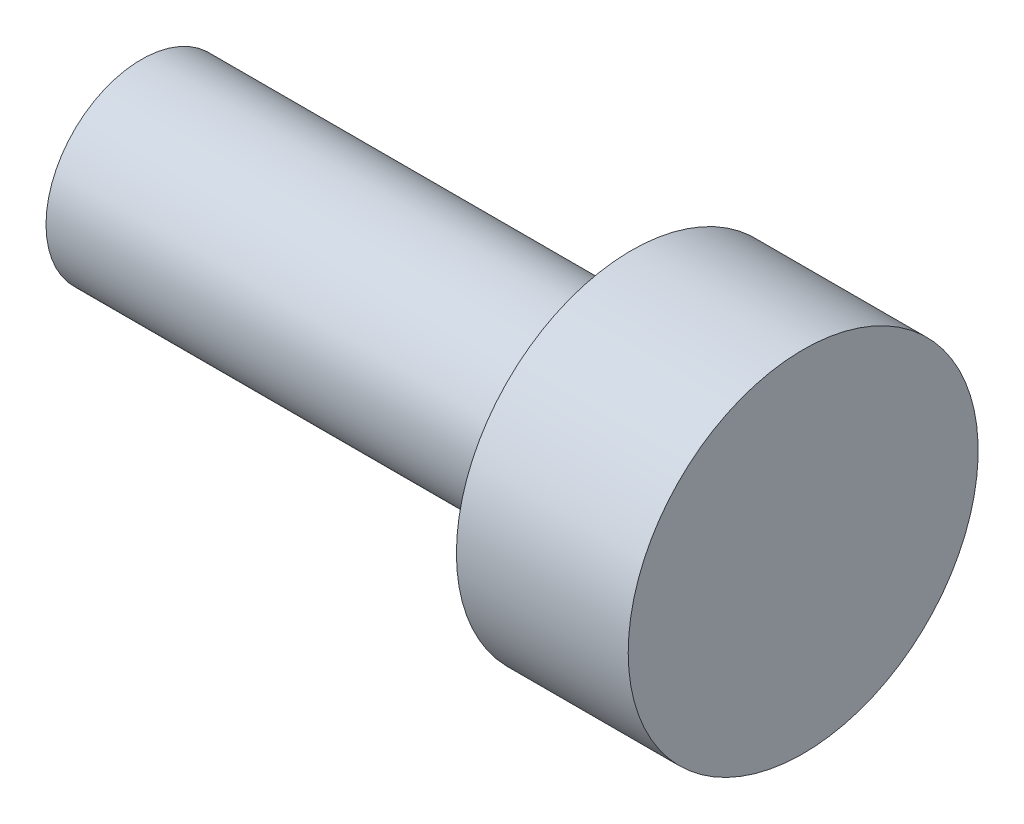
ISO-10303-21;
HEADER;
FILE_DESCRIPTION(('STEP AP214'),'2;1');
FILE_NAME('part.step','',(''),(''),'','','');
FILE_SCHEMA(('AUTOMOTIVE_DESIGN { 1 0 10303 214 1 1 1 1 }'));
ENDSEC;
DATA;
#1=APPLICATION_CONTEXT('core data for automotive mechanical design processes');
#2=APPLICATION_PROTOCOL_DEFINITION('international standard','automotive_design',2000,#1);
#3=PRODUCT_CONTEXT('',#1,'mechanical');
#4=PRODUCT('Part','Part','',(#3));
#5=PRODUCT_RELATED_PRODUCT_CATEGORY('part','',(#4));
#6=PRODUCT_DEFINITION_FORMATION('','',#4);
#7=PRODUCT_DEFINITION_CONTEXT('part definition',#1,'design');
#8=PRODUCT_DEFINITION('design','',#6,#7);
#9=PRODUCT_DEFINITION_SHAPE('','',#8);
#10=(LENGTH_UNIT() NAMED_UNIT(*) SI_UNIT(.MILLI.,.METRE.));
#11=(NAMED_UNIT(*) PLANE_ANGLE_UNIT() SI_UNIT($,.RADIAN.));
#12=(NAMED_UNIT(*) SI_UNIT($,.STERADIAN.) SOLID_ANGLE_UNIT());
#13=UNCERTAINTY_MEASURE_WITH_UNIT(LENGTH_MEASURE(1.E-05),#10,'distance_accuracy_value','');
#14=(GEOMETRIC_REPRESENTATION_CONTEXT(3) GLOBAL_UNCERTAINTY_ASSIGNED_CONTEXT((#13)) GLOBAL_UNIT_ASSIGNED_CONTEXT((#10,
#11,#12)) REPRESENTATION_CONTEXT('',''));
#15=CARTESIAN_POINT('',(0.,0.,0.));
#16=DIRECTION('',(0.,0.,1.));
#17=DIRECTION('',(1.,0.,0.));
#18=AXIS2_PLACEMENT_3D('',#15,#16,#17);
#19=CARTESIAN_POINT('',(132.,1.5,0.));
#20=DIRECTION('',(1.,0.,0.));
#21=DIRECTION('',(0.,0.,-1.));
#22=AXIS2_PLACEMENT_3D('',#19,#20,#21);
#23=PLANE('',#22);
#24=CARTESIAN_POINT('',(132.,0.,0.));
#25=DIRECTION('',(-1.,0.,0.));
#26=DIRECTION('',(0.,0.,1.));
#27=AXIS2_PLACEMENT_3D('',#24,#25,#26);
#28=CIRCLE('',#27,1.5);
#29=CARTESIAN_POINT('',(132.,0.,1.5));
#30=VERTEX_POINT('',#29);
#31=EDGE_CURVE('E45',#30,#30,#28,.T.);
#32=ORIENTED_EDGE('',*,*,#31,.T.);
#33=EDGE_LOOP('',(#32));
#34=FACE_BOUND('',#33,.T.);
#35=ADVANCED_FACE('F31',(#34),#23,.F.);
#36=CARTESIAN_POINT('',(142.4,0.,0.));
#37=DIRECTION('',(-1.,0.,0.));
#38=DIRECTION('',(0.,0.,1.));
#39=AXIS2_PLACEMENT_3D('',#36,#37,#38);
#40=PLANE('',#39);
#41=CARTESIAN_POINT('',(142.4,0.,0.));
#42=DIRECTION('',(-1.,0.,0.));
#43=DIRECTION('',(0.,0.,1.));
#44=AXIS2_PLACEMENT_3D('',#41,#42,#43);
#45=CIRCLE('',#44,2.75);
#46=CARTESIAN_POINT('',(142.4,0.,2.75));
#47=VERTEX_POINT('',#46);
#48=EDGE_CURVE('E10',#47,#47,#45,.T.);
#49=ORIENTED_EDGE('',*,*,#48,.F.);
#50=EDGE_LOOP('',(#49));
#51=FACE_BOUND('',#50,.T.);
#52=ADVANCED_FACE('F65',(#51),#40,.F.);
#53=CARTESIAN_POINT('',(-110.,0.,0.));
#54=DIRECTION('',(-1.,0.,0.));
#55=DIRECTION('',(0.,0.,1.));
#56=AXIS2_PLACEMENT_3D('',#53,#54,#55);
#57=CYLINDRICAL_SURFACE('',#56,2.75);
#58=CARTESIAN_POINT('',(139.7,0.,0.));
#59=DIRECTION('',(-1.,0.,0.));
#60=DIRECTION('',(0.,0.,1.));
#61=AXIS2_PLACEMENT_3D('',#58,#59,#60);
#62=CIRCLE('',#61,2.75);
#63=CARTESIAN_POINT('',(139.7,0.,2.75));
#64=VERTEX_POINT('',#63);
#65=EDGE_CURVE('E37',#64,#64,#62,.T.);
#66=ORIENTED_EDGE('',*,*,#65,.F.);
#67=EDGE_LOOP('',(#66));
#68=FACE_BOUND('',#67,.T.);
#69=ORIENTED_EDGE('',*,*,#48,.T.);
#70=EDGE_LOOP('',(#69));
#71=FACE_BOUND('',#70,.T.);
#72=ADVANCED_FACE('F60',(#68,#71),#57,.T.);
#73=CARTESIAN_POINT('',(139.7,2.75,0.));
#74=DIRECTION('',(1.,0.,0.));
#75=DIRECTION('',(0.,0.,-1.));
#76=AXIS2_PLACEMENT_3D('',#73,#74,#75);
#77=PLANE('',#76);
#78=CARTESIAN_POINT('',(139.7,0.,0.));
#79=DIRECTION('',(-1.,0.,0.));
#80=DIRECTION('',(0.,0.,1.));
#81=AXIS2_PLACEMENT_3D('',#78,#79,#80);
#82=CIRCLE('',#81,1.5);
#83=CARTESIAN_POINT('',(139.7,0.,1.5));
#84=VERTEX_POINT('',#83);
#85=EDGE_CURVE('E41',#84,#84,#82,.T.);
#86=ORIENTED_EDGE('',*,*,#85,.F.);
#87=EDGE_LOOP('',(#86));
#88=FACE_BOUND('',#87,.T.);
#89=ORIENTED_EDGE('',*,*,#65,.T.);
#90=EDGE_LOOP('',(#89));
#91=FACE_BOUND('',#90,.T.);
#92=ADVANCED_FACE('F55',(#88,#91),#77,.F.);
#93=CARTESIAN_POINT('',(-110.,0.,0.));
#94=DIRECTION('',(-1.,0.,0.));
#95=DIRECTION('',(0.,0.,1.));
#96=AXIS2_PLACEMENT_3D('',#93,#94,#95);
#97=CYLINDRICAL_SURFACE('',#96,1.5);
#98=ORIENTED_EDGE('',*,*,#31,.F.);
#99=EDGE_LOOP('',(#98));
#100=FACE_BOUND('',#99,.T.);
#101=ORIENTED_EDGE('',*,*,#85,.T.);
#102=EDGE_LOOP('',(#101));
#103=FACE_BOUND('',#102,.T.);
#104=ADVANCED_FACE('F52',(#100,#103),#97,.T.);
#105=CLOSED_SHELL('',(#35,#52,#72,#92,#104));
#106=MANIFOLD_SOLID_BREP('B2',#105);
#107=ADVANCED_BREP_SHAPE_REPRESENTATION('',(#18,#106),#14);
#108=SHAPE_DEFINITION_REPRESENTATION(#9,#107);
ENDSEC;
END-ISO-10303-21;
